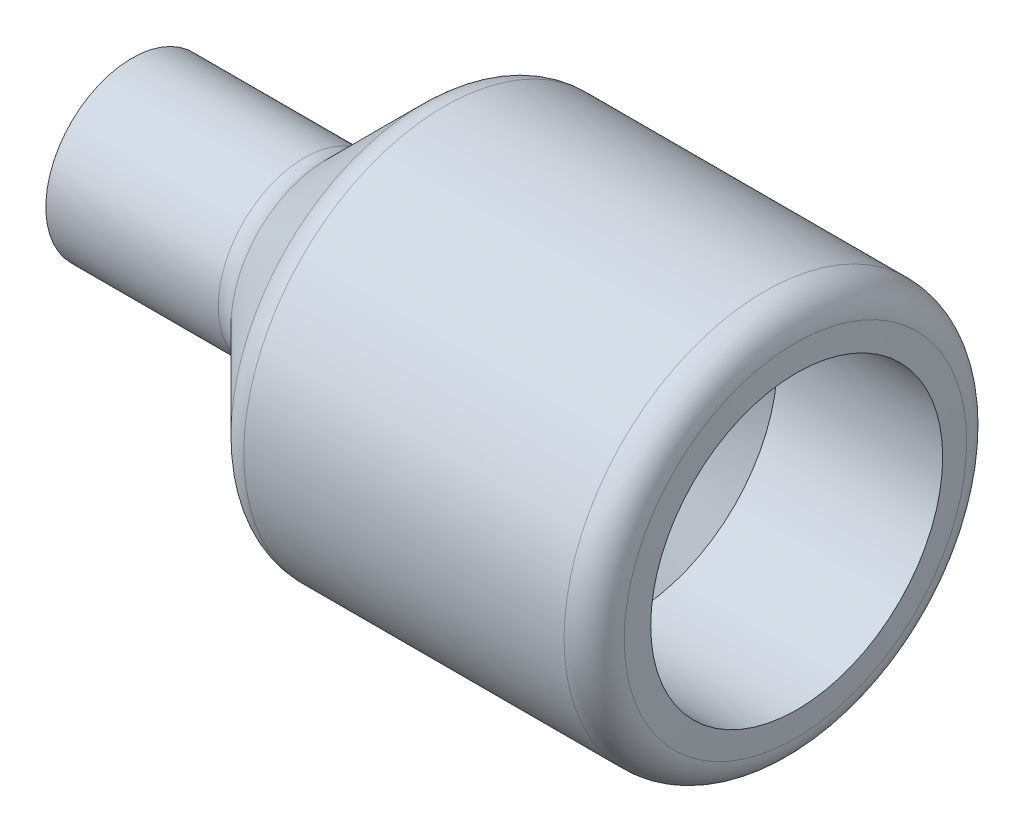
ISO-10303-21;
HEADER;
FILE_DESCRIPTION(('STEP AP214'),'2;1');
FILE_NAME('part.step','',(''),(''),'','','');
FILE_SCHEMA(('AUTOMOTIVE_DESIGN { 1 0 10303 214 1 1 1 1 }'));
ENDSEC;
DATA;
#1=APPLICATION_CONTEXT('core data for automotive mechanical design processes');
#2=APPLICATION_PROTOCOL_DEFINITION('international standard','automotive_design',2000,#1);
#3=PRODUCT_CONTEXT('',#1,'mechanical');
#4=PRODUCT('Part','Part','',(#3));
#5=PRODUCT_RELATED_PRODUCT_CATEGORY('part','',(#4));
#6=PRODUCT_DEFINITION_FORMATION('','',#4);
#7=PRODUCT_DEFINITION_CONTEXT('part definition',#1,'design');
#8=PRODUCT_DEFINITION('design','',#6,#7);
#9=PRODUCT_DEFINITION_SHAPE('','',#8);
#10=(LENGTH_UNIT() NAMED_UNIT(*) SI_UNIT(.MILLI.,.METRE.));
#11=(NAMED_UNIT(*) PLANE_ANGLE_UNIT() SI_UNIT($,.RADIAN.));
#12=(NAMED_UNIT(*) SI_UNIT($,.STERADIAN.) SOLID_ANGLE_UNIT());
#13=UNCERTAINTY_MEASURE_WITH_UNIT(LENGTH_MEASURE(1.E-05),#10,'distance_accuracy_value','');
#14=(GEOMETRIC_REPRESENTATION_CONTEXT(3) GLOBAL_UNCERTAINTY_ASSIGNED_CONTEXT((#13)) GLOBAL_UNIT_ASSIGNED_CONTEXT((#10,
#11,#12)) REPRESENTATION_CONTEXT('',''));
#15=CARTESIAN_POINT('',(0.,0.,0.));
#16=DIRECTION('',(0.,0.,1.));
#17=DIRECTION('',(1.,0.,0.));
#18=AXIS2_PLACEMENT_3D('',#15,#16,#17);
#19=CARTESIAN_POINT('',(-163.733660787474,3.81538136985131,142.741343515646));
#20=DIRECTION('',(1.,0.,0.));
#21=DIRECTION('',(0.,0.,-1.));
#22=AXIS2_PLACEMENT_3D('',#19,#20,#21);
#23=CONICAL_SURFACE('',#22,8.255,0.785398163397451);
#24=CARTESIAN_POINT('',(-168.073386399581,3.81538136985131,142.741343515646));
#25=DIRECTION('',(1.,0.,0.));
#26=DIRECTION('',(0.,0.,-1.));
#27=AXIS2_PLACEMENT_3D('',#24,#25,#26);
#28=CIRCLE('',#27,3.91527438789305);
#29=CARTESIAN_POINT('',(-168.073386399581,3.81538136985131,138.826069127753));
#30=VERTEX_POINT('',#29);
#31=EDGE_CURVE('E96',#30,#30,#28,.T.);
#32=ORIENTED_EDGE('',*,*,#31,.T.);
#33=EDGE_LOOP('',(#32));
#34=FACE_BOUND('',#33,.T.);
#35=CARTESIAN_POINT('',(-164.105635175367,3.81538136985131,142.741343515646));
#36=DIRECTION('',(-1.,0.,0.));
#37=DIRECTION('',(0.,0.,1.));
#38=AXIS2_PLACEMENT_3D('',#35,#36,#37);
#39=CIRCLE('',#38,7.88302561210691);
#40=CARTESIAN_POINT('',(-164.105635175367,3.81538136985131,150.624369127753));
#41=VERTEX_POINT('',#40);
#42=EDGE_CURVE('E85',#41,#41,#39,.T.);
#43=ORIENTED_EDGE('',*,*,#42,.T.);
#44=EDGE_LOOP('',(#43));
#45=FACE_BOUND('',#44,.T.);
#46=ADVANCED_FACE('F33',(#34,#45),#23,.T.);
#47=CARTESIAN_POINT('',(-161.519571032318,3.81538136985131,142.741343515646));
#48=DIRECTION('',(1.,0.,0.));
#49=DIRECTION('',(0.,0.,-1.));
#50=AXIS2_PLACEMENT_3D('',#47,#48,#49);
#51=CYLINDRICAL_SURFACE('',#50,3.54329999999998);
#52=CARTESIAN_POINT('',(-168.971412011688,3.81538136985131,142.741343515646));
#53=DIRECTION('',(1.,0.,0.));
#54=DIRECTION('',(0.,0.,-1.));
#55=AXIS2_PLACEMENT_3D('',#52,#53,#54);
#56=CIRCLE('',#55,3.54329999999998);
#57=CARTESIAN_POINT('',(-168.971412011688,3.81538136985131,139.198043515647));
#58=VERTEX_POINT('',#57);
#59=EDGE_CURVE('E91',#58,#58,#56,.F.);
#60=ORIENTED_EDGE('',*,*,#59,.T.);
#61=EDGE_LOOP('',(#60));
#62=FACE_BOUND('',#61,.T.);
#63=CARTESIAN_POINT('',(-176.065360787474,3.81538136985131,142.741343515646));
#64=DIRECTION('',(1.,0.,0.));
#65=DIRECTION('',(0.,0.,-1.));
#66=AXIS2_PLACEMENT_3D('',#63,#64,#65);
#67=CIRCLE('',#66,3.54329999999998);
#68=CARTESIAN_POINT('',(-176.065360787474,3.81538136985131,139.198043515647));
#69=VERTEX_POINT('',#68);
#70=EDGE_CURVE('E99',#69,#69,#67,.T.);
#71=ORIENTED_EDGE('',*,*,#70,.T.);
#72=EDGE_LOOP('',(#71));
#73=FACE_BOUND('',#72,.T.);
#74=ADVANCED_FACE('F56',(#62,#73),#51,.T.);
#75=CARTESIAN_POINT('',(-176.065360787474,3.81538136985131,142.741343515646));
#76=DIRECTION('',(-1.,0.,0.));
#77=DIRECTION('',(0.,0.,1.));
#78=AXIS2_PLACEMENT_3D('',#75,#76,#77);
#79=PLANE('',#78);
#80=ORIENTED_EDGE('',*,*,#70,.F.);
#81=EDGE_LOOP('',(#80));
#82=FACE_BOUND('',#81,.T.);
#83=ADVANCED_FACE('F46',(#82),#79,.T.);
#84=CARTESIAN_POINT('',(-161.519571032318,3.81538136985131,142.741343515646));
#85=DIRECTION('',(1.,0.,0.));
#86=DIRECTION('',(0.,0.,-1.));
#87=AXIS2_PLACEMENT_3D('',#84,#85,#86);
#88=CONICAL_SURFACE('',#87,0.,0.785398163397448);
#89=CARTESIAN_POINT('',(-155.510571032318,3.81538136985131,142.741343515646));
#90=DIRECTION('',(1.,0.,0.));
#91=DIRECTION('',(0.,0.,-1.));
#92=AXIS2_PLACEMENT_3D('',#89,#90,#91);
#93=CIRCLE('',#92,6.00899999999999);
#94=CARTESIAN_POINT('',(-155.510571032318,3.81538136985131,136.732343515646));
#95=VERTEX_POINT('',#94);
#96=EDGE_CURVE('E102',#95,#95,#93,.T.);
#97=ORIENTED_EDGE('',*,*,#96,.T.);
#98=EDGE_LOOP('',(#97));
#99=FACE_BOUND('',#98,.T.);
#100=CARTESIAN_POINT('',(-161.519571032318,3.81538136985131,142.741343515646));
#101=VERTEX_POINT('',#100);
#102=VERTEX_LOOP('',#101);
#103=FACE_BOUND('',#102,.T.);
#104=ADVANCED_FACE('F43',(#99,#103),#88,.F.);
#105=CARTESIAN_POINT('',(-161.519571032318,3.81538136985131,142.741343515646));
#106=DIRECTION('',(1.,0.,0.));
#107=DIRECTION('',(0.,0.,-1.));
#108=AXIS2_PLACEMENT_3D('',#105,#106,#107);
#109=CYLINDRICAL_SURFACE('',#108,6.00899999999999);
#110=CARTESIAN_POINT('',(-148.704260357145,3.81538136985131,142.741343515646));
#111=DIRECTION('',(1.,0.,0.));
#112=DIRECTION('',(0.,0.,-1.));
#113=AXIS2_PLACEMENT_3D('',#110,#111,#112);
#114=CIRCLE('',#113,6.00899999999999);
#115=CARTESIAN_POINT('',(-148.704260357145,3.81538136985131,136.732343515646));
#116=VERTEX_POINT('',#115);
#117=EDGE_CURVE('E104',#116,#116,#114,.T.);
#118=ORIENTED_EDGE('',*,*,#117,.T.);
#119=EDGE_LOOP('',(#118));
#120=FACE_BOUND('',#119,.T.);
#121=ORIENTED_EDGE('',*,*,#96,.F.);
#122=EDGE_LOOP('',(#121));
#123=FACE_BOUND('',#122,.T.);
#124=ADVANCED_FACE('F45',(#120,#123),#109,.F.);
#125=CARTESIAN_POINT('',(-148.704260357145,3.81538136985131,142.741343515646));
#126=DIRECTION('',(-1.,0.,0.));
#127=DIRECTION('',(0.,0.,1.));
#128=AXIS2_PLACEMENT_3D('',#125,#126,#127);
#129=CONICAL_SURFACE('',#128,6.00899999999999,1.52189052902649);
#130=CARTESIAN_POINT('',(-148.755069276242,3.81538136985131,142.741343515646));
#131=DIRECTION('',(1.,0.,0.));
#132=DIRECTION('',(0.,0.,-1.));
#133=AXIS2_PLACEMENT_3D('',#130,#131,#132);
#134=CIRCLE('',#133,7.04708560710302);
#135=CARTESIAN_POINT('',(-148.755069276242,3.81538136985131,135.694257908543));
#136=VERTEX_POINT('',#135);
#137=EDGE_CURVE('E11',#136,#136,#134,.T.);
#138=ORIENTED_EDGE('',*,*,#137,.T.);
#139=EDGE_LOOP('',(#138));
#140=FACE_BOUND('',#139,.T.);
#141=ORIENTED_EDGE('',*,*,#117,.F.);
#142=EDGE_LOOP('',(#141));
#143=FACE_BOUND('',#142,.T.);
#144=ADVANCED_FACE('F53',(#140,#143),#129,.T.);
#145=CARTESIAN_POINT('',(-161.519571032318,3.81538136985131,142.741343515646));
#146=DIRECTION('',(1.,0.,0.));
#147=DIRECTION('',(0.,0.,-1.));
#148=AXIS2_PLACEMENT_3D('',#145,#146,#147);
#149=CYLINDRICAL_SURFACE('',#148,8.255);
#150=CARTESIAN_POINT('',(-163.207609563261,3.81538136985131,142.741343515646));
#151=DIRECTION('',(-1.,0.,0.));
#152=DIRECTION('',(0.,0.,1.));
#153=AXIS2_PLACEMENT_3D('',#150,#151,#152);
#154=CIRCLE('',#153,8.255);
#155=CARTESIAN_POINT('',(-163.207609563261,3.81538136985131,150.996343515646));
#156=VERTEX_POINT('',#155);
#157=EDGE_CURVE('E40',#156,#156,#154,.F.);
#158=ORIENTED_EDGE('',*,*,#157,.T.);
#159=EDGE_LOOP('',(#158));
#160=FACE_BOUND('',#159,.T.);
#161=CARTESIAN_POINT('',(-150.023550800503,3.81538136985131,142.741343515646));
#162=DIRECTION('',(-1.,0.,0.));
#163=DIRECTION('',(0.,0.,1.));
#164=AXIS2_PLACEMENT_3D('',#161,#162,#163);
#165=CIRCLE('',#164,8.255);
#166=CARTESIAN_POINT('',(-150.023550800503,3.81538136985131,150.996343515646));
#167=VERTEX_POINT('',#166);
#168=EDGE_CURVE('E89',#167,#167,#165,.T.);
#169=ORIENTED_EDGE('',*,*,#168,.T.);
#170=EDGE_LOOP('',(#169));
#171=FACE_BOUND('',#170,.T.);
#172=ADVANCED_FACE('F74',(#160,#171),#149,.T.);
#173=CARTESIAN_POINT('',(-168.971412011688,3.81538136985131,142.741343515646));
#174=DIRECTION('',(1.,0.,0.));
#175=DIRECTION('',(0.,0.,-1.));
#176=AXIS2_PLACEMENT_3D('',#173,#174,#175);
#177=TOROIDAL_SURFACE('',#176,4.81329999999996,1.27);
#178=ORIENTED_EDGE('',*,*,#59,.F.);
#179=EDGE_LOOP('',(#178));
#180=FACE_BOUND('',#179,.T.);
#181=ORIENTED_EDGE('',*,*,#31,.F.);
#182=EDGE_LOOP('',(#181));
#183=FACE_BOUND('',#182,.T.);
#184=ADVANCED_FACE('F71',(#180,#183),#177,.F.);
#185=CARTESIAN_POINT('',(-163.207609563261,3.81538136985131,142.741343515646));
#186=DIRECTION('',(-1.,0.,0.));
#187=DIRECTION('',(0.,0.,1.));
#188=AXIS2_PLACEMENT_3D('',#185,#186,#187);
#189=TOROIDAL_SURFACE('',#188,6.98499999999999,1.27);
#190=ORIENTED_EDGE('',*,*,#42,.F.);
#191=EDGE_LOOP('',(#190));
#192=FACE_BOUND('',#191,.T.);
#193=ORIENTED_EDGE('',*,*,#157,.F.);
#194=EDGE_LOOP('',(#193));
#195=FACE_BOUND('',#194,.T.);
#196=ADVANCED_FACE('F73',(#192,#195),#189,.T.);
#197=CARTESIAN_POINT('',(-150.023550800503,3.81538136985131,142.741343515646));
#198=DIRECTION('',(-1.,0.,0.));
#199=DIRECTION('',(0.,0.,1.));
#200=AXIS2_PLACEMENT_3D('',#197,#198,#199);
#201=TOROIDAL_SURFACE('',#200,6.98499999999999,1.27);
#202=ORIENTED_EDGE('',*,*,#168,.F.);
#203=EDGE_LOOP('',(#202));
#204=FACE_BOUND('',#203,.T.);
#205=ORIENTED_EDGE('',*,*,#137,.F.);
#206=EDGE_LOOP('',(#205));
#207=FACE_BOUND('',#206,.T.);
#208=ADVANCED_FACE('F35',(#204,#207),#201,.T.);
#209=CLOSED_SHELL('',(#46,#74,#83,#104,#124,#144,#172,#184,#196,#208));
#210=MANIFOLD_SOLID_BREP('B2',#209);
#211=ADVANCED_BREP_SHAPE_REPRESENTATION('',(#18,#210),#14);
#212=SHAPE_DEFINITION_REPRESENTATION(#9,#211);
ENDSEC;
END-ISO-10303-21;
